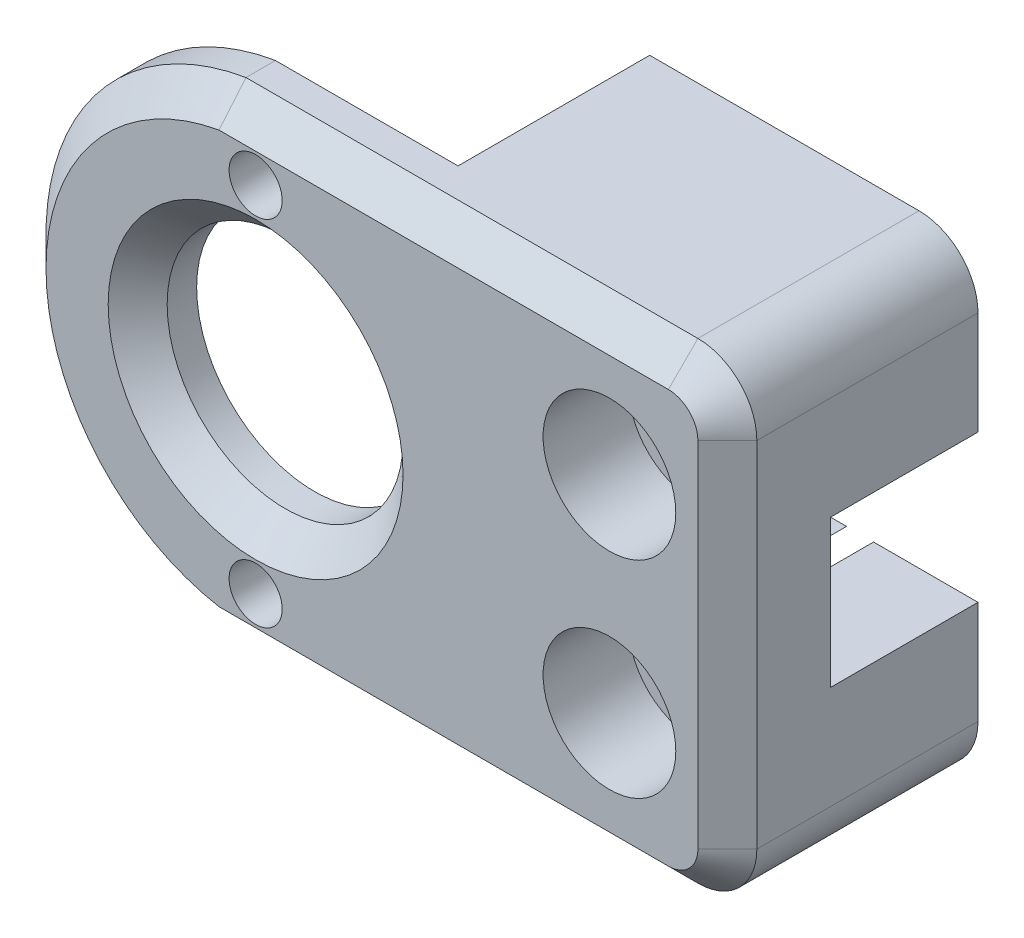
ISO-10303-21;
HEADER;
FILE_DESCRIPTION(('STEP AP214'),'2;1');
FILE_NAME('part.step','',(''),(''),'','','');
FILE_SCHEMA(('AUTOMOTIVE_DESIGN { 1 0 10303 214 1 1 1 1 }'));
ENDSEC;
DATA;
#1=APPLICATION_CONTEXT('core data for automotive mechanical design processes');
#2=APPLICATION_PROTOCOL_DEFINITION('international standard','automotive_design',2000,#1);
#3=PRODUCT_CONTEXT('',#1,'mechanical');
#4=PRODUCT('Part','Part','',(#3));
#5=PRODUCT_RELATED_PRODUCT_CATEGORY('part','',(#4));
#6=PRODUCT_DEFINITION_FORMATION('','',#4);
#7=PRODUCT_DEFINITION_CONTEXT('part definition',#1,'design');
#8=PRODUCT_DEFINITION('design','',#6,#7);
#9=PRODUCT_DEFINITION_SHAPE('','',#8);
#10=(LENGTH_UNIT() NAMED_UNIT(*) SI_UNIT(.MILLI.,.METRE.));
#11=(NAMED_UNIT(*) PLANE_ANGLE_UNIT() SI_UNIT($,.RADIAN.));
#12=(NAMED_UNIT(*) SI_UNIT($,.STERADIAN.) SOLID_ANGLE_UNIT());
#13=UNCERTAINTY_MEASURE_WITH_UNIT(LENGTH_MEASURE(1.E-05),#10,'distance_accuracy_value','');
#14=(GEOMETRIC_REPRESENTATION_CONTEXT(3) GLOBAL_UNCERTAINTY_ASSIGNED_CONTEXT((#13)) GLOBAL_UNIT_ASSIGNED_CONTEXT((#10,
#11,#12)) REPRESENTATION_CONTEXT('',''));
#15=CARTESIAN_POINT('',(0.,0.,0.));
#16=DIRECTION('',(0.,0.,1.));
#17=DIRECTION('',(1.,0.,0.));
#18=AXIS2_PLACEMENT_3D('',#15,#16,#17);
#19=CARTESIAN_POINT('',(12.,3.5,8.5));
#20=DIRECTION('',(0.,0.,-1.));
#21=DIRECTION('',(-1.,0.,0.));
#22=AXIS2_PLACEMENT_3D('',#19,#20,#21);
#23=CYLINDRICAL_SURFACE('',#22,1.1);
#24=DIRECTION('',(0.,0.,-1.));
#25=VECTOR('',#24,1.);
#26=CARTESIAN_POINT('',(12.4582575694956,2.5,8.5));
#27=LINE('',#26,#25);
#28=CARTESIAN_POINT('',(12.4582575694956,2.5,5.));
#29=VERTEX_POINT('',#28);
#30=CARTESIAN_POINT('',(12.4582575694956,2.5,0.));
#31=VERTEX_POINT('',#30);
#32=EDGE_CURVE('E497',#29,#31,#27,.T.);
#33=ORIENTED_EDGE('',*,*,#32,.F.);
#34=CARTESIAN_POINT('',(12.,3.5,5.));
#35=DIRECTION('',(0.,0.,1.));
#36=DIRECTION('',(1.,0.,0.));
#37=AXIS2_PLACEMENT_3D('',#34,#35,#36);
#38=CIRCLE('',#37,1.1);
#39=CARTESIAN_POINT('',(11.5417424305044,2.5,5.));
#40=VERTEX_POINT('',#39);
#41=EDGE_CURVE('E510',#40,#29,#38,.T.);
#42=ORIENTED_EDGE('',*,*,#41,.F.);
#43=DIRECTION('',(0.,0.,-1.));
#44=VECTOR('',#43,1.);
#45=CARTESIAN_POINT('',(11.5417424305044,2.5,8.5));
#46=LINE('',#45,#44);
#47=CARTESIAN_POINT('',(11.5417424305044,2.5,0.));
#48=VERTEX_POINT('',#47);
#49=EDGE_CURVE('E494',#48,#40,#46,.F.);
#50=ORIENTED_EDGE('',*,*,#49,.F.);
#51=CARTESIAN_POINT('',(12.,3.5,0.));
#52=DIRECTION('',(0.,0.,1.));
#53=DIRECTION('',(1.,0.,0.));
#54=AXIS2_PLACEMENT_3D('',#51,#52,#53);
#55=CIRCLE('',#54,1.1);
#56=EDGE_CURVE('E537',#31,#48,#55,.T.);
#57=ORIENTED_EDGE('',*,*,#56,.F.);
#58=EDGE_LOOP('',(#33,#42,#50,#57));
#59=FACE_BOUND('',#58,.T.);
#60=CARTESIAN_POINT('',(12.,3.5,5.6));
#61=DIRECTION('',(0.,0.,1.));
#62=DIRECTION('',(1.,0.,0.));
#63=AXIS2_PLACEMENT_3D('',#60,#61,#62);
#64=CIRCLE('',#63,1.1);
#65=CARTESIAN_POINT('',(13.1,3.5,5.6));
#66=VERTEX_POINT('',#65);
#67=EDGE_CURVE('E428',#66,#66,#64,.T.);
#68=ORIENTED_EDGE('',*,*,#67,.T.);
#69=EDGE_LOOP('',(#68));
#70=FACE_BOUND('',#69,.T.);
#71=ADVANCED_FACE('F37',(#59,#70),#23,.F.);
#72=CARTESIAN_POINT('',(0.,0.,8.5));
#73=DIRECTION('',(0.,0.,1.));
#74=DIRECTION('',(1.,0.,0.));
#75=AXIS2_PLACEMENT_3D('',#72,#73,#74);
#76=PLANE('',#75);
#77=CARTESIAN_POINT('',(0.,0.,8.5));
#78=DIRECTION('',(0.,0.,1.));
#79=DIRECTION('',(1.,0.,0.));
#80=AXIS2_PLACEMENT_3D('',#77,#78,#79);
#81=CIRCLE('',#80,5.);
#82=CARTESIAN_POINT('',(5.,0.,8.5));
#83=VERTEX_POINT('',#82);
#84=EDGE_CURVE('E13',#83,#83,#81,.F.);
#85=ORIENTED_EDGE('',*,*,#84,.T.);
#86=EDGE_LOOP('',(#85));
#87=FACE_BOUND('',#86,.T.);
#88=CARTESIAN_POINT('',(12.,3.5,8.5));
#89=DIRECTION('',(0.,0.,1.));
#90=DIRECTION('',(1.,0.,0.));
#91=AXIS2_PLACEMENT_3D('',#88,#89,#90);
#92=CIRCLE('',#91,2.25);
#93=CARTESIAN_POINT('',(14.25,3.5,8.5));
#94=VERTEX_POINT('',#93);
#95=EDGE_CURVE('E666',#94,#94,#92,.T.);
#96=ORIENTED_EDGE('',*,*,#95,.F.);
#97=EDGE_LOOP('',(#96));
#98=FACE_BOUND('',#97,.T.);
#99=CARTESIAN_POINT('',(0.,0.,8.5));
#100=DIRECTION('',(0.,0.,1.));
#101=DIRECTION('',(1.,0.,0.));
#102=AXIS2_PLACEMENT_3D('',#99,#100,#101);
#103=CIRCLE('',#102,7.10925397308531);
#104=CARTESIAN_POINT('',(-1.24156838468013,6.99999999999999,8.5));
#105=VERTEX_POINT('',#104);
#106=CARTESIAN_POINT('',(-1.24156838468013,-6.99999999999999,8.5));
#107=VERTEX_POINT('',#106);
#108=EDGE_CURVE('E568',#105,#107,#103,.T.);
#109=ORIENTED_EDGE('',*,*,#108,.T.);
#110=DIRECTION('',(-1.,0.,0.));
#111=VECTOR('',#110,1.);
#112=CARTESIAN_POINT('',(-1.32664991614216,-6.99999999999999,8.5));
#113=LINE('',#112,#111);
#114=CARTESIAN_POINT('',(14.,-6.99999999999999,8.5));
#115=VERTEX_POINT('',#114);
#116=EDGE_CURVE('E263',#115,#107,#113,.T.);
#117=ORIENTED_EDGE('',*,*,#116,.F.);
#118=CARTESIAN_POINT('',(14.,-5.99999999999999,8.5));
#119=DIRECTION('',(0.,0.,-1.));
#120=DIRECTION('',(1.,0.,0.));
#121=AXIS2_PLACEMENT_3D('',#118,#119,#120);
#122=CIRCLE('',#121,0.999999999999996);
#123=CARTESIAN_POINT('',(15.,-5.99999999999999,8.5));
#124=VERTEX_POINT('',#123);
#125=EDGE_CURVE('E266',#124,#115,#122,.T.);
#126=ORIENTED_EDGE('',*,*,#125,.F.);
#127=DIRECTION('',(0.,1.,0.));
#128=VECTOR('',#127,1.);
#129=CARTESIAN_POINT('',(15.,6.,8.5));
#130=LINE('',#129,#128);
#131=CARTESIAN_POINT('',(15.,6.,8.5));
#132=VERTEX_POINT('',#131);
#133=EDGE_CURVE('E572',#124,#132,#130,.T.);
#134=ORIENTED_EDGE('',*,*,#133,.T.);
#135=CARTESIAN_POINT('',(14.,6.,8.5));
#136=DIRECTION('',(0.,0.,1.));
#137=DIRECTION('',(1.,0.,0.));
#138=AXIS2_PLACEMENT_3D('',#135,#136,#137);
#139=CIRCLE('',#138,0.999999999999996);
#140=CARTESIAN_POINT('',(14.,7.,8.5));
#141=VERTEX_POINT('',#140);
#142=EDGE_CURVE('E570',#132,#141,#139,.T.);
#143=ORIENTED_EDGE('',*,*,#142,.T.);
#144=DIRECTION('',(-1.,0.,0.));
#145=VECTOR('',#144,1.);
#146=CARTESIAN_POINT('',(-1.32664991614216,6.99999999999999,8.5));
#147=LINE('',#146,#145);
#148=EDGE_CURVE('E566',#141,#105,#147,.T.);
#149=ORIENTED_EDGE('',*,*,#148,.T.);
#150=EDGE_LOOP('',(#109,#117,#126,#134,#143,#149));
#151=FACE_BOUND('',#150,.T.);
#152=CARTESIAN_POINT('',(0.,6.,8.5));
#153=DIRECTION('',(0.,0.,1.));
#154=DIRECTION('',(1.,0.,0.));
#155=AXIS2_PLACEMENT_3D('',#152,#153,#154);
#156=CIRCLE('',#155,0.9);
#157=CARTESIAN_POINT('',(0.9,6.,8.5));
#158=VERTEX_POINT('',#157);
#159=EDGE_CURVE('E540',#158,#158,#156,.T.);
#160=ORIENTED_EDGE('',*,*,#159,.F.);
#161=EDGE_LOOP('',(#160));
#162=FACE_BOUND('',#161,.T.);
#163=CARTESIAN_POINT('',(12.,-3.5,8.5));
#164=DIRECTION('',(0.,0.,-1.));
#165=DIRECTION('',(1.,0.,0.));
#166=AXIS2_PLACEMENT_3D('',#163,#164,#165);
#167=CIRCLE('',#166,2.25);
#168=CARTESIAN_POINT('',(14.25,-3.49999999999999,8.5));
#169=VERTEX_POINT('',#168);
#170=EDGE_CURVE('E442',#169,#169,#167,.T.);
#171=ORIENTED_EDGE('',*,*,#170,.T.);
#172=EDGE_LOOP('',(#171));
#173=FACE_BOUND('',#172,.T.);
#174=CARTESIAN_POINT('',(0.,-6.,8.5));
#175=DIRECTION('',(0.,0.,-1.));
#176=DIRECTION('',(1.,0.,0.));
#177=AXIS2_PLACEMENT_3D('',#174,#175,#176);
#178=CIRCLE('',#177,0.9);
#179=CARTESIAN_POINT('',(0.900000000000002,-6.,8.5));
#180=VERTEX_POINT('',#179);
#181=EDGE_CURVE('E236',#180,#180,#178,.T.);
#182=ORIENTED_EDGE('',*,*,#181,.T.);
#183=EDGE_LOOP('',(#182));
#184=FACE_BOUND('',#183,.T.);
#185=ADVANCED_FACE('F359',(#87,#98,#151,#162,#173,#184),#76,.T.);
#186=CARTESIAN_POINT('',(0.,0.,0.));
#187=DIRECTION('',(0.,0.,1.));
#188=DIRECTION('',(1.,0.,0.));
#189=AXIS2_PLACEMENT_3D('',#186,#187,#188);
#190=PLANE('',#189);
#191=DIRECTION('',(0.,1.,0.));
#192=VECTOR('',#191,1.);
#193=CARTESIAN_POINT('',(16.,8.,0.));
#194=LINE('',#193,#192);
#195=CARTESIAN_POINT('',(16.,2.5,0.));
#196=VERTEX_POINT('',#195);
#197=CARTESIAN_POINT('',(16.,6.,0.));
#198=VERTEX_POINT('',#197);
#199=EDGE_CURVE('E543',#196,#198,#194,.T.);
#200=ORIENTED_EDGE('',*,*,#199,.F.);
#201=DIRECTION('',(1.,0.,0.));
#202=VECTOR('',#201,1.);
#203=CARTESIAN_POINT('',(16.,2.5,0.));
#204=LINE('',#203,#202);
#205=EDGE_CURVE('E431',#31,#196,#204,.T.);
#206=ORIENTED_EDGE('',*,*,#205,.F.);
#207=ORIENTED_EDGE('',*,*,#56,.T.);
#208=CARTESIAN_POINT('',(8.,2.5,0.));
#209=VERTEX_POINT('',#208);
#210=EDGE_CURVE('E503',#209,#48,#204,.T.);
#211=ORIENTED_EDGE('',*,*,#210,.F.);
#212=DIRECTION('',(0.,-1.,0.));
#213=VECTOR('',#212,1.);
#214=CARTESIAN_POINT('',(8.,4.12310562561766,0.));
#215=LINE('',#214,#213);
#216=CARTESIAN_POINT('',(8.,4.12310562561766,0.));
#217=VERTEX_POINT('',#216);
#218=EDGE_CURVE('E513',#217,#209,#215,.T.);
#219=ORIENTED_EDGE('',*,*,#218,.F.);
#220=DIRECTION('',(0.631512516045507,-0.775365682809004,0.));
#221=VECTOR('',#220,1.);
#222=CARTESIAN_POINT('',(5.65685424949238,7.,0.));
#223=LINE('',#222,#221);
#224=CARTESIAN_POINT('',(5.65685424949238,7.,0.));
#225=VERTEX_POINT('',#224);
#226=EDGE_CURVE('E517',#225,#217,#223,.T.);
#227=ORIENTED_EDGE('',*,*,#226,.F.);
#228=CARTESIAN_POINT('',(0.,0.,0.));
#229=DIRECTION('',(0.,0.,-1.));
#230=DIRECTION('',(1.,0.,0.));
#231=AXIS2_PLACEMENT_3D('',#228,#229,#230);
#232=CIRCLE('',#231,9.);
#233=CARTESIAN_POINT('',(5.03913107919878,7.45702071652298,0.));
#234=VERTEX_POINT('',#233);
#235=EDGE_CURVE('E425',#234,#225,#232,.T.);
#236=ORIENTED_EDGE('',*,*,#235,.F.);
#237=DIRECTION('',(-0.304597589118864,0.952481132990557,0.));
#238=VECTOR('',#237,1.);
#239=CARTESIAN_POINT('',(4.8654896547547,8.,0.));
#240=LINE('',#239,#238);
#241=CARTESIAN_POINT('',(4.8654896547547,8.,0.));
#242=VERTEX_POINT('',#241);
#243=EDGE_CURVE('E564',#234,#242,#240,.T.);
#244=ORIENTED_EDGE('',*,*,#243,.T.);
#245=DIRECTION('',(-1.,0.,0.));
#246=VECTOR('',#245,1.);
#247=CARTESIAN_POINT('',(-1.32664991614216,8.,0.));
#248=LINE('',#247,#246);
#249=CARTESIAN_POINT('',(14.,8.,0.));
#250=VERTEX_POINT('',#249);
#251=EDGE_CURVE('E545',#250,#242,#248,.T.);
#252=ORIENTED_EDGE('',*,*,#251,.F.);
#253=CARTESIAN_POINT('',(14.,6.,0.));
#254=DIRECTION('',(0.,0.,1.));
#255=DIRECTION('',(1.,0.,0.));
#256=AXIS2_PLACEMENT_3D('',#253,#254,#255);
#257=CIRCLE('',#256,2.);
#258=EDGE_CURVE('E552',#250,#198,#257,.F.);
#259=ORIENTED_EDGE('',*,*,#258,.T.);
#260=EDGE_LOOP('',(#200,#206,#207,#211,#219,#227,#236,#244,#252,#259));
#261=FACE_BOUND('',#260,.T.);
#262=ADVANCED_FACE('F365',(#261),#190,.F.);
#263=CARTESIAN_POINT('',(0.,0.,8.5));
#264=DIRECTION('',(0.,0.,-1.));
#265=DIRECTION('',(-1.,0.,0.));
#266=AXIS2_PLACEMENT_3D('',#263,#264,#265);
#267=CYLINDRICAL_SURFACE('',#266,8.10925397308531);
#268=CARTESIAN_POINT('',(0.,0.,6.5));
#269=DIRECTION('',(0.,0.,1.));
#270=DIRECTION('',(1.,0.,0.));
#271=AXIS2_PLACEMENT_3D('',#268,#269,#270);
#272=CIRCLE('',#271,8.10925397308531);
#273=CARTESIAN_POINT('',(-1.32664991614216,8.,6.5));
#274=VERTEX_POINT('',#273);
#275=CARTESIAN_POINT('',(-1.32664991614216,-8.,6.5));
#276=VERTEX_POINT('',#275);
#277=EDGE_CURVE('E535',#274,#276,#272,.T.);
#278=ORIENTED_EDGE('',*,*,#277,.T.);
#279=DIRECTION('',(0.,0.,-1.));
#280=VECTOR('',#279,1.);
#281=CARTESIAN_POINT('',(-1.32664991614216,-8.,8.5));
#282=LINE('',#281,#280);
#283=CARTESIAN_POINT('',(-1.32664991614216,-8.,7.49999999999999));
#284=VERTEX_POINT('',#283);
#285=EDGE_CURVE('E239',#284,#276,#282,.T.);
#286=ORIENTED_EDGE('',*,*,#285,.F.);
#287=CARTESIAN_POINT('',(0.,0.,7.49999999999999));
#288=DIRECTION('',(0.,0.,1.));
#289=DIRECTION('',(1.,0.,0.));
#290=AXIS2_PLACEMENT_3D('',#287,#288,#289);
#291=CIRCLE('',#290,8.10925397308531);
#292=CARTESIAN_POINT('',(-1.32664991614216,8.,7.49999999999999));
#293=VERTEX_POINT('',#292);
#294=EDGE_CURVE('E578',#284,#293,#291,.F.);
#295=ORIENTED_EDGE('',*,*,#294,.T.);
#296=DIRECTION('',(0.,0.,-1.));
#297=VECTOR('',#296,1.);
#298=CARTESIAN_POINT('',(-1.32664991614216,8.,8.5));
#299=LINE('',#298,#297);
#300=EDGE_CURVE('E548',#293,#274,#299,.T.);
#301=ORIENTED_EDGE('',*,*,#300,.T.);
#302=EDGE_LOOP('',(#278,#286,#295,#301));
#303=FACE_BOUND('',#302,.T.);
#304=ADVANCED_FACE('F382',(#303),#267,.T.);
#305=CARTESIAN_POINT('',(16.,8.,8.5));
#306=DIRECTION('',(-1.,0.,0.));
#307=DIRECTION('',(0.,0.,1.));
#308=AXIS2_PLACEMENT_3D('',#305,#306,#307);
#309=PLANE('',#308);
#310=DIRECTION('',(0.,-1.,0.));
#311=VECTOR('',#310,1.);
#312=CARTESIAN_POINT('',(16.,0.,7.49999999999999));
#313=LINE('',#312,#311);
#314=CARTESIAN_POINT('',(16.,6.,7.49999999999999));
#315=VERTEX_POINT('',#314);
#316=CARTESIAN_POINT('',(16.,-5.99999999999999,7.49999999999999));
#317=VERTEX_POINT('',#316);
#318=EDGE_CURVE('E575',#315,#317,#313,.T.);
#319=ORIENTED_EDGE('',*,*,#318,.T.);
#320=DIRECTION('',(0.,0.,-1.));
#321=VECTOR('',#320,1.);
#322=CARTESIAN_POINT('',(16.,-5.99999999999999,8.5));
#323=LINE('',#322,#321);
#324=CARTESIAN_POINT('',(16.,-5.99999999999999,0.));
#325=VERTEX_POINT('',#324);
#326=EDGE_CURVE('E233',#325,#317,#323,.F.);
#327=ORIENTED_EDGE('',*,*,#326,.F.);
#328=DIRECTION('',(0.,-1.,0.));
#329=VECTOR('',#328,1.);
#330=CARTESIAN_POINT('',(16.,-7.99999999999999,0.));
#331=LINE('',#330,#329);
#332=CARTESIAN_POINT('',(16.,-2.49999999999999,0.));
#333=VERTEX_POINT('',#332);
#334=EDGE_CURVE('E224',#333,#325,#331,.T.);
#335=ORIENTED_EDGE('',*,*,#334,.F.);
#336=DIRECTION('',(0.,0.,-1.));
#337=VECTOR('',#336,1.);
#338=CARTESIAN_POINT('',(16.,-2.49999999999999,14.8815273071201));
#339=LINE('',#338,#337);
#340=CARTESIAN_POINT('',(16.,-2.49999999999999,5.));
#341=VERTEX_POINT('',#340);
#342=EDGE_CURVE('E207',#341,#333,#339,.T.);
#343=ORIENTED_EDGE('',*,*,#342,.F.);
#344=DIRECTION('',(0.,-1.,0.));
#345=VECTOR('',#344,1.);
#346=CARTESIAN_POINT('',(16.,0.,5.));
#347=LINE('',#346,#345);
#348=CARTESIAN_POINT('',(16.,2.5,5.));
#349=VERTEX_POINT('',#348);
#350=EDGE_CURVE('E489',#349,#341,#347,.T.);
#351=ORIENTED_EDGE('',*,*,#350,.F.);
#352=DIRECTION('',(0.,0.,-1.));
#353=VECTOR('',#352,1.);
#354=CARTESIAN_POINT('',(16.,2.5,14.8815273071201));
#355=LINE('',#354,#353);
#356=EDGE_CURVE('E495',#349,#196,#355,.T.);
#357=ORIENTED_EDGE('',*,*,#356,.T.);
#358=ORIENTED_EDGE('',*,*,#199,.T.);
#359=DIRECTION('',(0.,0.,-1.));
#360=VECTOR('',#359,1.);
#361=CARTESIAN_POINT('',(16.,6.,8.5));
#362=LINE('',#361,#360);
#363=EDGE_CURVE('E555',#198,#315,#362,.F.);
#364=ORIENTED_EDGE('',*,*,#363,.T.);
#365=EDGE_LOOP('',(#319,#327,#335,#343,#351,#357,#358,#364));
#366=FACE_BOUND('',#365,.T.);
#367=ADVANCED_FACE('F231',(#366),#309,.F.);
#368=CARTESIAN_POINT('',(-1.32664991614216,8.,8.5));
#369=DIRECTION('',(0.,-1.,0.));
#370=DIRECTION('',(1.,0.,0.));
#371=AXIS2_PLACEMENT_3D('',#368,#369,#370);
#372=PLANE('',#371);
#373=ORIENTED_EDGE('',*,*,#251,.T.);
#374=DIRECTION('',(0.,0.,1.));
#375=VECTOR('',#374,1.);
#376=CARTESIAN_POINT('',(4.8654896547547,8.,8.5));
#377=LINE('',#376,#375);
#378=CARTESIAN_POINT('',(4.8654896547547,8.,6.5));
#379=VERTEX_POINT('',#378);
#380=EDGE_CURVE('E559',#242,#379,#377,.T.);
#381=ORIENTED_EDGE('',*,*,#380,.T.);
#382=DIRECTION('',(-1.,0.,0.));
#383=VECTOR('',#382,1.);
#384=CARTESIAN_POINT('',(-1.32664991614216,8.,6.5));
#385=LINE('',#384,#383);
#386=EDGE_CURVE('E532',#379,#274,#385,.T.);
#387=ORIENTED_EDGE('',*,*,#386,.T.);
#388=ORIENTED_EDGE('',*,*,#300,.F.);
#389=DIRECTION('',(1.,0.,0.));
#390=VECTOR('',#389,1.);
#391=CARTESIAN_POINT('',(14.,8.,7.49999999999999));
#392=LINE('',#391,#390);
#393=CARTESIAN_POINT('',(14.,8.,7.49999999999999));
#394=VERTEX_POINT('',#393);
#395=EDGE_CURVE('E557',#293,#394,#392,.T.);
#396=ORIENTED_EDGE('',*,*,#395,.T.);
#397=DIRECTION('',(0.,0.,-1.));
#398=VECTOR('',#397,1.);
#399=CARTESIAN_POINT('',(14.,8.,8.5));
#400=LINE('',#399,#398);
#401=EDGE_CURVE('E550',#394,#250,#400,.T.);
#402=ORIENTED_EDGE('',*,*,#401,.T.);
#403=EDGE_LOOP('',(#373,#381,#387,#388,#396,#402));
#404=FACE_BOUND('',#403,.T.);
#405=ADVANCED_FACE('F377',(#404),#372,.F.);
#406=CARTESIAN_POINT('',(0.,6.,8.5));
#407=DIRECTION('',(0.,0.,-1.));
#408=DIRECTION('',(-1.,0.,0.));
#409=AXIS2_PLACEMENT_3D('',#406,#407,#408);
#410=CYLINDRICAL_SURFACE('',#409,0.9);
#411=CARTESIAN_POINT('',(0.,6.,6.7));
#412=DIRECTION('',(0.,0.,1.));
#413=DIRECTION('',(1.,0.,0.));
#414=AXIS2_PLACEMENT_3D('',#411,#412,#413);
#415=CIRCLE('',#414,0.9);
#416=CARTESIAN_POINT('',(0.9,6.,6.7));
#417=VERTEX_POINT('',#416);
#418=EDGE_CURVE('E436',#417,#417,#415,.F.);
#419=ORIENTED_EDGE('',*,*,#418,.T.);
#420=EDGE_LOOP('',(#419));
#421=FACE_BOUND('',#420,.T.);
#422=ORIENTED_EDGE('',*,*,#159,.T.);
#423=EDGE_LOOP('',(#422));
#424=FACE_BOUND('',#423,.T.);
#425=ADVANCED_FACE('F374',(#421,#424),#410,.F.);
#426=CARTESIAN_POINT('',(14.,6.,8.5));
#427=DIRECTION('',(0.,0.,-1.));
#428=DIRECTION('',(-1.,0.,0.));
#429=AXIS2_PLACEMENT_3D('',#426,#427,#428);
#430=CYLINDRICAL_SURFACE('',#429,2.);
#431=ORIENTED_EDGE('',*,*,#401,.F.);
#432=CARTESIAN_POINT('',(14.,6.,7.49999999999999));
#433=DIRECTION('',(0.,0.,1.));
#434=DIRECTION('',(1.,0.,0.));
#435=AXIS2_PLACEMENT_3D('',#432,#433,#434);
#436=CIRCLE('',#435,2.);
#437=EDGE_CURVE('E60',#394,#315,#436,.F.);
#438=ORIENTED_EDGE('',*,*,#437,.T.);
#439=ORIENTED_EDGE('',*,*,#363,.F.);
#440=ORIENTED_EDGE('',*,*,#258,.F.);
#441=EDGE_LOOP('',(#431,#438,#439,#440));
#442=FACE_BOUND('',#441,.T.);
#443=ADVANCED_FACE('F376',(#442),#430,.T.);
#444=CARTESIAN_POINT('',(0.,0.,27.7353840616713));
#445=DIRECTION('',(0.,0.,-1.));
#446=DIRECTION('',(-1.,0.,0.));
#447=AXIS2_PLACEMENT_3D('',#444,#445,#446);
#448=CYLINDRICAL_SURFACE('',#447,9.);
#449=CARTESIAN_POINT('',(0.,0.,6.5));
#450=DIRECTION('',(0.,0.,1.));
#451=DIRECTION('',(1.,0.,0.));
#452=AXIS2_PLACEMENT_3D('',#449,#450,#451);
#453=CIRCLE('',#452,9.);
#454=CARTESIAN_POINT('',(5.03913107919878,7.45702071652298,6.5));
#455=VERTEX_POINT('',#454);
#456=CARTESIAN_POINT('',(5.65685424949238,7.,6.5));
#457=VERTEX_POINT('',#456);
#458=EDGE_CURVE('E524',#455,#457,#453,.F.);
#459=ORIENTED_EDGE('',*,*,#458,.F.);
#460=DIRECTION('',(0.,0.,-1.));
#461=VECTOR('',#460,1.);
#462=CARTESIAN_POINT('',(5.03913107919878,7.45702071652298,27.7353840616713));
#463=LINE('',#462,#461);
#464=EDGE_CURVE('E562',#455,#234,#463,.T.);
#465=ORIENTED_EDGE('',*,*,#464,.T.);
#466=ORIENTED_EDGE('',*,*,#235,.T.);
#467=DIRECTION('',(0.,0.,-1.));
#468=VECTOR('',#467,1.);
#469=CARTESIAN_POINT('',(5.65685424949238,7.,27.7353840616713));
#470=LINE('',#469,#468);
#471=EDGE_CURVE('E526',#457,#225,#470,.T.);
#472=ORIENTED_EDGE('',*,*,#471,.F.);
#473=EDGE_LOOP('',(#459,#465,#466,#472));
#474=FACE_BOUND('',#473,.T.);
#475=ADVANCED_FACE('F394',(#474),#448,.F.);
#476=CARTESIAN_POINT('',(0.,0.,6.5));
#477=DIRECTION('',(0.,0.,1.));
#478=DIRECTION('',(1.,0.,0.));
#479=AXIS2_PLACEMENT_3D('',#476,#477,#478);
#480=PLANE('',#479);
#481=CARTESIAN_POINT('',(0.,0.,6.5));
#482=DIRECTION('',(0.,0.,1.));
#483=DIRECTION('',(1.,0.,0.));
#484=AXIS2_PLACEMENT_3D('',#481,#482,#483);
#485=CIRCLE('',#484,4.);
#486=CARTESIAN_POINT('',(4.,0.,6.5));
#487=VERTEX_POINT('',#486);
#488=EDGE_CURVE('E440',#487,#487,#485,.T.);
#489=ORIENTED_EDGE('',*,*,#488,.T.);
#490=EDGE_LOOP('',(#489));
#491=FACE_BOUND('',#490,.T.);
#492=CARTESIAN_POINT('',(0.,6.,6.5));
#493=DIRECTION('',(0.,0.,1.));
#494=DIRECTION('',(1.,0.,0.));
#495=AXIS2_PLACEMENT_3D('',#492,#493,#494);
#496=CIRCLE('',#495,1.1);
#497=CARTESIAN_POINT('',(1.1,6.,6.5));
#498=VERTEX_POINT('',#497);
#499=EDGE_CURVE('E433',#498,#498,#496,.T.);
#500=ORIENTED_EDGE('',*,*,#499,.T.);
#501=EDGE_LOOP('',(#500));
#502=FACE_BOUND('',#501,.T.);
#503=ORIENTED_EDGE('',*,*,#386,.F.);
#504=DIRECTION('',(0.304597589118864,-0.952481132990557,0.));
#505=VECTOR('',#504,1.);
#506=CARTESIAN_POINT('',(6.73505868089872,2.15383020799024,6.5));
#507=LINE('',#506,#505);
#508=EDGE_CURVE('E437',#379,#455,#507,.T.);
#509=ORIENTED_EDGE('',*,*,#508,.T.);
#510=ORIENTED_EDGE('',*,*,#458,.T.);
#511=DIRECTION('',(0.631512516045507,-0.775365682809004,0.));
#512=VECTOR('',#511,1.);
#513=CARTESIAN_POINT('',(5.65685424949238,7.,6.5));
#514=LINE('',#513,#512);
#515=CARTESIAN_POINT('',(8.,4.12310562561766,6.5));
#516=VERTEX_POINT('',#515);
#517=EDGE_CURVE('E516',#457,#516,#514,.T.);
#518=ORIENTED_EDGE('',*,*,#517,.T.);
#519=DIRECTION('',(0.,-1.,0.));
#520=VECTOR('',#519,1.);
#521=CARTESIAN_POINT('',(8.,4.12310562561766,6.5));
#522=LINE('',#521,#520);
#523=CARTESIAN_POINT('',(8.,-4.12310562561766,6.5));
#524=VERTEX_POINT('',#523);
#525=EDGE_CURVE('E527',#516,#524,#522,.T.);
#526=ORIENTED_EDGE('',*,*,#525,.T.);
#527=DIRECTION('',(0.631512516045507,0.775365682809004,0.));
#528=VECTOR('',#527,1.);
#529=CARTESIAN_POINT('',(5.65685424949238,-7.,6.5));
#530=LINE('',#529,#528);
#531=CARTESIAN_POINT('',(5.65685424949238,-7.,6.5));
#532=VERTEX_POINT('',#531);
#533=EDGE_CURVE('E467',#532,#524,#530,.T.);
#534=ORIENTED_EDGE('',*,*,#533,.F.);
#535=CARTESIAN_POINT('',(0.,0.,6.5));
#536=DIRECTION('',(0.,0.,-1.));
#537=DIRECTION('',(1.,0.,0.));
#538=AXIS2_PLACEMENT_3D('',#535,#536,#537);
#539=CIRCLE('',#538,9.);
#540=CARTESIAN_POINT('',(5.03913107919878,-7.45702071652298,6.5));
#541=VERTEX_POINT('',#540);
#542=EDGE_CURVE('E476',#541,#532,#539,.F.);
#543=ORIENTED_EDGE('',*,*,#542,.F.);
#544=DIRECTION('',(0.304597589118864,0.952481132990557,0.));
#545=VECTOR('',#544,1.);
#546=CARTESIAN_POINT('',(6.73505868089872,-2.15383020799024,6.5));
#547=LINE('',#546,#545);
#548=CARTESIAN_POINT('',(4.86548965475471,-8.,6.5));
#549=VERTEX_POINT('',#548);
#550=EDGE_CURVE('E272',#549,#541,#547,.T.);
#551=ORIENTED_EDGE('',*,*,#550,.F.);
#552=DIRECTION('',(-1.,0.,0.));
#553=VECTOR('',#552,1.);
#554=CARTESIAN_POINT('',(-1.32664991614216,-8.,6.5));
#555=LINE('',#554,#553);
#556=EDGE_CURVE('E482',#549,#276,#555,.T.);
#557=ORIENTED_EDGE('',*,*,#556,.T.);
#558=ORIENTED_EDGE('',*,*,#277,.F.);
#559=EDGE_LOOP('',(#503,#509,#510,#518,#526,#534,#543,#551,#557,#558));
#560=FACE_BOUND('',#559,.T.);
#561=CARTESIAN_POINT('',(0.,-6.,6.5));
#562=DIRECTION('',(0.,0.,-1.));
#563=DIRECTION('',(1.,0.,0.));
#564=AXIS2_PLACEMENT_3D('',#561,#562,#563);
#565=CIRCLE('',#564,1.1);
#566=CARTESIAN_POINT('',(1.1,-6.,6.5));
#567=VERTEX_POINT('',#566);
#568=EDGE_CURVE('E274',#567,#567,#565,.T.);
#569=ORIENTED_EDGE('',*,*,#568,.F.);
#570=EDGE_LOOP('',(#569));
#571=FACE_BOUND('',#570,.T.);
#572=ADVANCED_FACE('F372',(#491,#502,#560,#571),#480,.F.);
#573=CARTESIAN_POINT('',(5.65685424949238,7.,27.7353840616713));
#574=DIRECTION('',(0.775365682809004,0.631512516045507,0.));
#575=DIRECTION('',(-0.631512516045507,0.775365682809004,0.));
#576=AXIS2_PLACEMENT_3D('',#573,#574,#575);
#577=PLANE('',#576);
#578=ORIENTED_EDGE('',*,*,#471,.T.);
#579=ORIENTED_EDGE('',*,*,#226,.T.);
#580=DIRECTION('',(0.,0.,-1.));
#581=VECTOR('',#580,1.);
#582=CARTESIAN_POINT('',(8.,4.12310562561766,27.7353840616713));
#583=LINE('',#582,#581);
#584=EDGE_CURVE('E523',#516,#217,#583,.T.);
#585=ORIENTED_EDGE('',*,*,#584,.F.);
#586=ORIENTED_EDGE('',*,*,#517,.F.);
#587=EDGE_LOOP('',(#578,#579,#585,#586));
#588=FACE_BOUND('',#587,.T.);
#589=ADVANCED_FACE('F615',(#588),#577,.F.);
#590=CARTESIAN_POINT('',(8.,4.12310562561766,27.7353840616713));
#591=DIRECTION('',(1.,0.,0.));
#592=DIRECTION('',(0.,0.,-1.));
#593=AXIS2_PLACEMENT_3D('',#590,#591,#592);
#594=PLANE('',#593);
#595=DIRECTION('',(0.,0.,-1.));
#596=VECTOR('',#595,1.);
#597=CARTESIAN_POINT('',(8.,2.5,14.8815273071201));
#598=LINE('',#597,#596);
#599=CARTESIAN_POINT('',(8.,2.5,5.));
#600=VERTEX_POINT('',#599);
#601=EDGE_CURVE('E506',#600,#209,#598,.T.);
#602=ORIENTED_EDGE('',*,*,#601,.F.);
#603=DIRECTION('',(0.,1.,0.));
#604=VECTOR('',#603,1.);
#605=CARTESIAN_POINT('',(8.,0.,5.));
#606=LINE('',#605,#604);
#607=CARTESIAN_POINT('',(8.,-2.5,5.));
#608=VERTEX_POINT('',#607);
#609=EDGE_CURVE('E52',#608,#600,#606,.T.);
#610=ORIENTED_EDGE('',*,*,#609,.F.);
#611=DIRECTION('',(0.,0.,-1.));
#612=VECTOR('',#611,1.);
#613=CARTESIAN_POINT('',(8.,-2.5,14.8815273071201));
#614=LINE('',#613,#612);
#615=CARTESIAN_POINT('',(8.,-2.5,0.));
#616=VERTEX_POINT('',#615);
#617=EDGE_CURVE('E455',#608,#616,#614,.T.);
#618=ORIENTED_EDGE('',*,*,#617,.T.);
#619=DIRECTION('',(0.,1.,0.));
#620=VECTOR('',#619,1.);
#621=CARTESIAN_POINT('',(8.,-4.12310562561766,0.));
#622=LINE('',#621,#620);
#623=CARTESIAN_POINT('',(8.,-4.12310562561766,0.));
#624=VERTEX_POINT('',#623);
#625=EDGE_CURVE('E464',#624,#616,#622,.T.);
#626=ORIENTED_EDGE('',*,*,#625,.F.);
#627=DIRECTION('',(0.,0.,-1.));
#628=VECTOR('',#627,1.);
#629=CARTESIAN_POINT('',(8.,-4.12310562561766,27.7353840616713));
#630=LINE('',#629,#628);
#631=EDGE_CURVE('E475',#524,#624,#630,.T.);
#632=ORIENTED_EDGE('',*,*,#631,.F.);
#633=ORIENTED_EDGE('',*,*,#525,.F.);
#634=ORIENTED_EDGE('',*,*,#584,.T.);
#635=ORIENTED_EDGE('',*,*,#218,.T.);
#636=EDGE_LOOP('',(#602,#610,#618,#626,#632,#633,#634,#635));
#637=FACE_BOUND('',#636,.T.);
#638=ADVANCED_FACE('F399',(#637),#594,.F.);
#639=CARTESIAN_POINT('',(4.8654896547547,8.,27.7353840616713));
#640=DIRECTION('',(-0.952481132990557,-0.304597589118864,0.));
#641=DIRECTION('',(0.,0.,-1.));
#642=AXIS2_PLACEMENT_3D('',#639,#640,#641);
#643=PLANE('',#642);
#644=ORIENTED_EDGE('',*,*,#243,.F.);
#645=ORIENTED_EDGE('',*,*,#464,.F.);
#646=ORIENTED_EDGE('',*,*,#508,.F.);
#647=ORIENTED_EDGE('',*,*,#380,.F.);
#648=EDGE_LOOP('',(#644,#645,#646,#647));
#649=FACE_BOUND('',#648,.T.);
#650=ADVANCED_FACE('F395',(#649),#643,.T.);
#651=CARTESIAN_POINT('',(0.,0.,8.5));
#652=DIRECTION('',(0.,0.,-1.));
#653=DIRECTION('',(-1.,0.,0.));
#654=AXIS2_PLACEMENT_3D('',#651,#652,#653);
#655=CONICAL_SURFACE('',#654,7.10925397308531,0.785398163397447);
#656=ORIENTED_EDGE('',*,*,#294,.F.);
#657=CARTESIAN_POINT('',(-1.32664991614216,-8.,7.49999999999999));
#658=CARTESIAN_POINT('',(-1.3129376124772,-7.83331343715008,7.66668656284991));
#659=CARTESIAN_POINT('',(-1.29899133349733,-7.66663682778922,7.83336317221077));
#660=CARTESIAN_POINT('',(-1.27063082307066,-7.33330349445321,8.16669650554679));
#661=CARTESIAN_POINT('',(-1.25621659156324,-7.16664677048064,8.33335322951935));
#662=CARTESIAN_POINT('',(-1.24156838468028,-6.99999999999971,8.50000000000029));
#663=B_SPLINE_CURVE_WITH_KNOTS('',3,(#657,#658,#659,#660,#661,#662),.UNSPECIFIED.,.F.,.F.,(4,2,
4),(0.,0.70838559148326,1.41677127474088),.UNSPECIFIED.);
#664=EDGE_CURVE('E281',#284,#107,#663,.T.);
#665=ORIENTED_EDGE('',*,*,#664,.T.);
#666=ORIENTED_EDGE('',*,*,#108,.F.);
#667=CARTESIAN_POINT('',(-1.32664991614216,8.,7.49999999999999));
#668=CARTESIAN_POINT('',(-1.3129376124772,7.83331343715008,7.66668656284991));
#669=CARTESIAN_POINT('',(-1.29899133349733,7.66663682778922,7.83336317221077));
#670=CARTESIAN_POINT('',(-1.27063082307066,7.33330349445321,8.16669650554679));
#671=CARTESIAN_POINT('',(-1.25621659156324,7.16664677048064,8.33335322951935));
#672=CARTESIAN_POINT('',(-1.24156838468029,6.99999999999971,8.50000000000029));
#673=B_SPLINE_CURVE_WITH_KNOTS('',3,(#667,#668,#669,#670,#671,#672),.UNSPECIFIED.,.F.,.F.,(4,2,
4),(0.,0.70838559148326,1.41677127474088),.UNSPECIFIED.);
#674=EDGE_CURVE('E417',#293,#105,#673,.T.);
#675=ORIENTED_EDGE('',*,*,#674,.F.);
#676=EDGE_LOOP('',(#656,#665,#666,#675));
#677=FACE_BOUND('',#676,.T.);
#678=ADVANCED_FACE('F398',(#677),#655,.T.);
#679=CARTESIAN_POINT('',(0.,6.99999999999999,8.5));
#680=DIRECTION('',(0.,0.707106781186549,0.707106781186546));
#681=DIRECTION('',(1.,0.,0.));
#682=AXIS2_PLACEMENT_3D('',#679,#680,#681);
#683=PLANE('',#682);
#684=ORIENTED_EDGE('',*,*,#674,.T.);
#685=ORIENTED_EDGE('',*,*,#148,.F.);
#686=DIRECTION('',(0.,-0.707106781186546,0.707106781186549));
#687=VECTOR('',#686,1.);
#688=CARTESIAN_POINT('',(14.,8.,7.49999999999999));
#689=LINE('',#688,#687);
#690=EDGE_CURVE('E426',#394,#141,#689,.T.);
#691=ORIENTED_EDGE('',*,*,#690,.F.);
#692=ORIENTED_EDGE('',*,*,#395,.F.);
#693=EDGE_LOOP('',(#684,#685,#691,#692));
#694=FACE_BOUND('',#693,.T.);
#695=ADVANCED_FACE('F409',(#694),#683,.T.);
#696=CARTESIAN_POINT('',(14.,6.,8.5));
#697=DIRECTION('',(0.,0.,-1.));
#698=DIRECTION('',(-1.,0.,0.));
#699=AXIS2_PLACEMENT_3D('',#696,#697,#698);
#700=CONICAL_SURFACE('',#699,0.999999999999996,0.785398163397447);
#701=ORIENTED_EDGE('',*,*,#690,.T.);
#702=ORIENTED_EDGE('',*,*,#142,.F.);
#703=DIRECTION('',(-0.707106781186546,0.,0.707106781186549));
#704=VECTOR('',#703,1.);
#705=CARTESIAN_POINT('',(16.,6.,7.49999999999999));
#706=LINE('',#705,#704);
#707=EDGE_CURVE('E512',#315,#132,#706,.T.);
#708=ORIENTED_EDGE('',*,*,#707,.F.);
#709=ORIENTED_EDGE('',*,*,#437,.F.);
#710=EDGE_LOOP('',(#701,#702,#708,#709));
#711=FACE_BOUND('',#710,.T.);
#712=ADVANCED_FACE('F405',(#711),#700,.T.);
#713=CARTESIAN_POINT('',(15.,0.,8.5));
#714=DIRECTION('',(0.707106781186549,0.,0.707106781186546));
#715=DIRECTION('',(0.,-1.,0.));
#716=AXIS2_PLACEMENT_3D('',#713,#714,#715);
#717=PLANE('',#716);
#718=ORIENTED_EDGE('',*,*,#133,.F.);
#719=DIRECTION('',(-0.707106781186546,0.,0.707106781186549));
#720=VECTOR('',#719,1.);
#721=CARTESIAN_POINT('',(16.,-5.99999999999999,7.49999999999999));
#722=LINE('',#721,#720);
#723=EDGE_CURVE('E275',#317,#124,#722,.T.);
#724=ORIENTED_EDGE('',*,*,#723,.F.);
#725=ORIENTED_EDGE('',*,*,#318,.F.);
#726=ORIENTED_EDGE('',*,*,#707,.T.);
#727=EDGE_LOOP('',(#718,#724,#725,#726));
#728=FACE_BOUND('',#727,.T.);
#729=ADVANCED_FACE('F401',(#728),#717,.T.);
#730=CARTESIAN_POINT('',(16.,2.5,14.8815273071201));
#731=DIRECTION('',(0.,1.,0.));
#732=DIRECTION('',(0.,0.,1.));
#733=AXIS2_PLACEMENT_3D('',#730,#731,#732);
#734=PLANE('',#733);
#735=ORIENTED_EDGE('',*,*,#32,.T.);
#736=ORIENTED_EDGE('',*,*,#205,.T.);
#737=ORIENTED_EDGE('',*,*,#356,.F.);
#738=DIRECTION('',(1.,0.,0.));
#739=VECTOR('',#738,1.);
#740=CARTESIAN_POINT('',(16.,2.5,5.));
#741=LINE('',#740,#739);
#742=EDGE_CURVE('E491',#29,#349,#741,.T.);
#743=ORIENTED_EDGE('',*,*,#742,.F.);
#744=EDGE_LOOP('',(#735,#736,#737,#743));
#745=FACE_BOUND('',#744,.T.);
#746=ADVANCED_FACE('F404',(#745),#734,.F.);
#747=CARTESIAN_POINT('',(0.,0.,5.));
#748=DIRECTION('',(0.,0.,1.));
#749=DIRECTION('',(1.,0.,0.));
#750=AXIS2_PLACEMENT_3D('',#747,#748,#749);
#751=PLANE('',#750);
#752=ORIENTED_EDGE('',*,*,#41,.T.);
#753=ORIENTED_EDGE('',*,*,#742,.T.);
#754=ORIENTED_EDGE('',*,*,#350,.T.);
#755=DIRECTION('',(1.,0.,0.));
#756=VECTOR('',#755,1.);
#757=CARTESIAN_POINT('',(16.,-2.49999999999999,5.));
#758=LINE('',#757,#756);
#759=CARTESIAN_POINT('',(12.4582575694956,-2.5,5.));
#760=VERTEX_POINT('',#759);
#761=EDGE_CURVE('E213',#760,#341,#758,.T.);
#762=ORIENTED_EDGE('',*,*,#761,.F.);
#763=CARTESIAN_POINT('',(12.,-3.5,5.));
#764=DIRECTION('',(0.,0.,-1.));
#765=DIRECTION('',(1.,0.,0.));
#766=AXIS2_PLACEMENT_3D('',#763,#764,#765);
#767=CIRCLE('',#766,1.1);
#768=CARTESIAN_POINT('',(11.5417424305044,-2.5,5.));
#769=VERTEX_POINT('',#768);
#770=EDGE_CURVE('E279',#769,#760,#767,.T.);
#771=ORIENTED_EDGE('',*,*,#770,.F.);
#772=EDGE_CURVE('E218',#608,#769,#758,.T.);
#773=ORIENTED_EDGE('',*,*,#772,.F.);
#774=ORIENTED_EDGE('',*,*,#609,.T.);
#775=EDGE_CURVE('E499',#600,#40,#741,.T.);
#776=ORIENTED_EDGE('',*,*,#775,.T.);
#777=EDGE_LOOP('',(#752,#753,#754,#762,#771,#773,#774,#776));
#778=FACE_BOUND('',#777,.T.);
#779=ADVANCED_FACE('F487',(#778),#751,.F.);
#780=ORIENTED_EDGE('',*,*,#49,.T.);
#781=ORIENTED_EDGE('',*,*,#775,.F.);
#782=ORIENTED_EDGE('',*,*,#601,.T.);
#783=ORIENTED_EDGE('',*,*,#210,.T.);
#784=EDGE_LOOP('',(#780,#781,#782,#783));
#785=FACE_BOUND('',#784,.T.);
#786=ADVANCED_FACE('F636',(#785),#734,.F.);
#787=CARTESIAN_POINT('',(12.,3.5,-1.36396103067893));
#788=DIRECTION('',(0.,0.,1.));
#789=DIRECTION('',(1.,0.,0.));
#790=AXIS2_PLACEMENT_3D('',#787,#788,#789);
#791=CYLINDRICAL_SURFACE('',#790,2.25);
#792=CARTESIAN_POINT('',(12.,3.5,5.6));
#793=DIRECTION('',(0.,0.,1.));
#794=DIRECTION('',(1.,0.,0.));
#795=AXIS2_PLACEMENT_3D('',#792,#793,#794);
#796=CIRCLE('',#795,2.25);
#797=CARTESIAN_POINT('',(14.25,3.5,5.6));
#798=VERTEX_POINT('',#797);
#799=EDGE_CURVE('E432',#798,#798,#796,.F.);
#800=ORIENTED_EDGE('',*,*,#799,.T.);
#801=EDGE_LOOP('',(#800));
#802=FACE_BOUND('',#801,.T.);
#803=ORIENTED_EDGE('',*,*,#95,.T.);
#804=EDGE_LOOP('',(#803));
#805=FACE_BOUND('',#804,.T.);
#806=ADVANCED_FACE('F650',(#802,#805),#791,.F.);
#807=CARTESIAN_POINT('',(0.,0.,5.6));
#808=DIRECTION('',(0.,0.,1.));
#809=DIRECTION('',(1.,0.,0.));
#810=AXIS2_PLACEMENT_3D('',#807,#808,#809);
#811=PLANE('',#810);
#812=ORIENTED_EDGE('',*,*,#67,.F.);
#813=EDGE_LOOP('',(#812));
#814=FACE_BOUND('',#813,.T.);
#815=ORIENTED_EDGE('',*,*,#799,.F.);
#816=EDGE_LOOP('',(#815));
#817=FACE_BOUND('',#816,.T.);
#818=ADVANCED_FACE('F654',(#814,#817),#811,.T.);
#819=CARTESIAN_POINT('',(0.,6.,6.5));
#820=DIRECTION('',(0.,0.,-1.));
#821=DIRECTION('',(-1.,0.,0.));
#822=AXIS2_PLACEMENT_3D('',#819,#820,#821);
#823=CONICAL_SURFACE('',#822,1.1,0.785398163397448);
#824=ORIENTED_EDGE('',*,*,#418,.F.);
#825=EDGE_LOOP('',(#824));
#826=FACE_BOUND('',#825,.T.);
#827=ORIENTED_EDGE('',*,*,#499,.F.);
#828=EDGE_LOOP('',(#827));
#829=FACE_BOUND('',#828,.T.);
#830=ADVANCED_FACE('F326',(#826,#829),#823,.F.);
#831=CARTESIAN_POINT('',(12.,-3.5,8.5));
#832=DIRECTION('',(0.,0.,-1.));
#833=DIRECTION('',(-1.,0.,0.));
#834=AXIS2_PLACEMENT_3D('',#831,#832,#833);
#835=CYLINDRICAL_SURFACE('',#834,1.1);
#836=DIRECTION('',(0.,0.,-1.));
#837=VECTOR('',#836,1.);
#838=CARTESIAN_POINT('',(12.4582575694956,-2.5,8.5));
#839=LINE('',#838,#837);
#840=CARTESIAN_POINT('',(12.4582575694956,-2.5,0.));
#841=VERTEX_POINT('',#840);
#842=EDGE_CURVE('E460',#760,#841,#839,.T.);
#843=ORIENTED_EDGE('',*,*,#842,.T.);
#844=CARTESIAN_POINT('',(12.,-3.5,0.));
#845=DIRECTION('',(0.,0.,-1.));
#846=DIRECTION('',(1.,0.,0.));
#847=AXIS2_PLACEMENT_3D('',#844,#845,#846);
#848=CIRCLE('',#847,1.1);
#849=CARTESIAN_POINT('',(11.5417424305044,-2.5,0.));
#850=VERTEX_POINT('',#849);
#851=EDGE_CURVE('E226',#841,#850,#848,.T.);
#852=ORIENTED_EDGE('',*,*,#851,.T.);
#853=DIRECTION('',(0.,0.,-1.));
#854=VECTOR('',#853,1.);
#855=CARTESIAN_POINT('',(11.5417424305044,-2.5,8.5));
#856=LINE('',#855,#854);
#857=EDGE_CURVE('E217',#850,#769,#856,.F.);
#858=ORIENTED_EDGE('',*,*,#857,.T.);
#859=ORIENTED_EDGE('',*,*,#770,.T.);
#860=EDGE_LOOP('',(#843,#852,#858,#859));
#861=FACE_BOUND('',#860,.T.);
#862=CARTESIAN_POINT('',(12.,-3.5,5.6));
#863=DIRECTION('',(0.,0.,-1.));
#864=DIRECTION('',(1.,0.,0.));
#865=AXIS2_PLACEMENT_3D('',#862,#863,#864);
#866=CIRCLE('',#865,1.1);
#867=CARTESIAN_POINT('',(13.1,-3.5,5.6));
#868=VERTEX_POINT('',#867);
#869=EDGE_CURVE('E229',#868,#868,#866,.T.);
#870=ORIENTED_EDGE('',*,*,#869,.F.);
#871=EDGE_LOOP('',(#870));
#872=FACE_BOUND('',#871,.T.);
#873=ADVANCED_FACE('F320',(#861,#872),#835,.F.);
#874=CARTESIAN_POINT('',(0.,0.,0.));
#875=DIRECTION('',(0.,0.,1.));
#876=DIRECTION('',(1.,0.,0.));
#877=AXIS2_PLACEMENT_3D('',#874,#875,#876);
#878=PLANE('',#877);
#879=ORIENTED_EDGE('',*,*,#334,.T.);
#880=CARTESIAN_POINT('',(14.,-5.99999999999999,0.));
#881=DIRECTION('',(0.,0.,-1.));
#882=DIRECTION('',(1.,0.,0.));
#883=AXIS2_PLACEMENT_3D('',#880,#881,#882);
#884=CIRCLE('',#883,2.);
#885=CARTESIAN_POINT('',(14.,-7.99999999999999,0.));
#886=VERTEX_POINT('',#885);
#887=EDGE_CURVE('E249',#886,#325,#884,.F.);
#888=ORIENTED_EDGE('',*,*,#887,.F.);
#889=DIRECTION('',(-1.,0.,0.));
#890=VECTOR('',#889,1.);
#891=CARTESIAN_POINT('',(-1.32664991614216,-8.,0.));
#892=LINE('',#891,#890);
#893=CARTESIAN_POINT('',(4.86548965475471,-8.,0.));
#894=VERTEX_POINT('',#893);
#895=EDGE_CURVE('E235',#886,#894,#892,.T.);
#896=ORIENTED_EDGE('',*,*,#895,.T.);
#897=DIRECTION('',(-0.304597589118864,-0.952481132990557,0.));
#898=VECTOR('',#897,1.);
#899=CARTESIAN_POINT('',(4.86548965475471,-8.,0.));
#900=LINE('',#899,#898);
#901=CARTESIAN_POINT('',(5.03913107919878,-7.45702071652298,0.));
#902=VERTEX_POINT('',#901);
#903=EDGE_CURVE('E260',#902,#894,#900,.T.);
#904=ORIENTED_EDGE('',*,*,#903,.F.);
#905=CARTESIAN_POINT('',(0.,0.,0.));
#906=DIRECTION('',(0.,0.,1.));
#907=DIRECTION('',(1.,0.,0.));
#908=AXIS2_PLACEMENT_3D('',#905,#906,#907);
#909=CIRCLE('',#908,9.);
#910=CARTESIAN_POINT('',(5.65685424949238,-7.,0.));
#911=VERTEX_POINT('',#910);
#912=EDGE_CURVE('E290',#902,#911,#909,.T.);
#913=ORIENTED_EDGE('',*,*,#912,.T.);
#914=DIRECTION('',(0.631512516045507,0.775365682809004,0.));
#915=VECTOR('',#914,1.);
#916=CARTESIAN_POINT('',(5.65685424949238,-7.,0.));
#917=LINE('',#916,#915);
#918=EDGE_CURVE('E468',#911,#624,#917,.T.);
#919=ORIENTED_EDGE('',*,*,#918,.T.);
#920=ORIENTED_EDGE('',*,*,#625,.T.);
#921=DIRECTION('',(1.,0.,0.));
#922=VECTOR('',#921,1.);
#923=CARTESIAN_POINT('',(16.,-2.49999999999999,0.));
#924=LINE('',#923,#922);
#925=EDGE_CURVE('E228',#616,#850,#924,.T.);
#926=ORIENTED_EDGE('',*,*,#925,.T.);
#927=ORIENTED_EDGE('',*,*,#851,.F.);
#928=EDGE_CURVE('E211',#841,#333,#924,.T.);
#929=ORIENTED_EDGE('',*,*,#928,.T.);
#930=EDGE_LOOP('',(#879,#888,#896,#904,#913,#919,#920,#926,#927,#929));
#931=FACE_BOUND('',#930,.T.);
#932=ADVANCED_FACE('F222',(#931),#878,.F.);
#933=CARTESIAN_POINT('',(-1.32664991614216,-8.,8.5));
#934=DIRECTION('',(0.,1.,0.));
#935=DIRECTION('',(1.,0.,0.));
#936=AXIS2_PLACEMENT_3D('',#933,#934,#935);
#937=PLANE('',#936);
#938=ORIENTED_EDGE('',*,*,#895,.F.);
#939=DIRECTION('',(0.,0.,-1.));
#940=VECTOR('',#939,1.);
#941=CARTESIAN_POINT('',(14.,-7.99999999999999,8.5));
#942=LINE('',#941,#940);
#943=CARTESIAN_POINT('',(14.,-7.99999999999999,7.49999999999999));
#944=VERTEX_POINT('',#943);
#945=EDGE_CURVE('E247',#944,#886,#942,.T.);
#946=ORIENTED_EDGE('',*,*,#945,.F.);
#947=DIRECTION('',(1.,0.,0.));
#948=VECTOR('',#947,1.);
#949=CARTESIAN_POINT('',(14.,-7.99999999999999,7.49999999999999));
#950=LINE('',#949,#948);
#951=EDGE_CURVE('E252',#284,#944,#950,.T.);
#952=ORIENTED_EDGE('',*,*,#951,.F.);
#953=ORIENTED_EDGE('',*,*,#285,.T.);
#954=ORIENTED_EDGE('',*,*,#556,.F.);
#955=DIRECTION('',(0.,0.,1.));
#956=VECTOR('',#955,1.);
#957=CARTESIAN_POINT('',(4.86548965475471,-8.,8.5));
#958=LINE('',#957,#956);
#959=EDGE_CURVE('E255',#894,#549,#958,.T.);
#960=ORIENTED_EDGE('',*,*,#959,.F.);
#961=EDGE_LOOP('',(#938,#946,#952,#953,#954,#960));
#962=FACE_BOUND('',#961,.T.);
#963=ADVANCED_FACE('F314',(#962),#937,.F.);
#964=CARTESIAN_POINT('',(0.,-6.,8.5));
#965=DIRECTION('',(0.,0.,-1.));
#966=DIRECTION('',(-1.,0.,0.));
#967=AXIS2_PLACEMENT_3D('',#964,#965,#966);
#968=CYLINDRICAL_SURFACE('',#967,0.9);
#969=CARTESIAN_POINT('',(0.,-6.,6.7));
#970=DIRECTION('',(0.,0.,-1.));
#971=DIRECTION('',(1.,0.,0.));
#972=AXIS2_PLACEMENT_3D('',#969,#970,#971);
#973=CIRCLE('',#972,0.9);
#974=CARTESIAN_POINT('',(0.900000000000002,-6.,6.7));
#975=VERTEX_POINT('',#974);
#976=EDGE_CURVE('E668',#975,#975,#973,.F.);
#977=ORIENTED_EDGE('',*,*,#976,.F.);
#978=EDGE_LOOP('',(#977));
#979=FACE_BOUND('',#978,.T.);
#980=ORIENTED_EDGE('',*,*,#181,.F.);
#981=EDGE_LOOP('',(#980));
#982=FACE_BOUND('',#981,.T.);
#983=ADVANCED_FACE('F312',(#979,#982),#968,.F.);
#984=CARTESIAN_POINT('',(14.,-5.99999999999999,8.5));
#985=DIRECTION('',(0.,0.,-1.));
#986=DIRECTION('',(-1.,0.,0.));
#987=AXIS2_PLACEMENT_3D('',#984,#985,#986);
#988=CYLINDRICAL_SURFACE('',#987,2.);
#989=ORIENTED_EDGE('',*,*,#945,.T.);
#990=ORIENTED_EDGE('',*,*,#887,.T.);
#991=ORIENTED_EDGE('',*,*,#326,.T.);
#992=CARTESIAN_POINT('',(14.,-5.99999999999999,7.49999999999999));
#993=DIRECTION('',(0.,0.,-1.));
#994=DIRECTION('',(1.,0.,0.));
#995=AXIS2_PLACEMENT_3D('',#992,#993,#994);
#996=CIRCLE('',#995,2.);
#997=EDGE_CURVE('E269',#944,#317,#996,.F.);
#998=ORIENTED_EDGE('',*,*,#997,.F.);
#999=EDGE_LOOP('',(#989,#990,#991,#998));
#1000=FACE_BOUND('',#999,.T.);
#1001=ADVANCED_FACE('F308',(#1000),#988,.T.);
#1002=CARTESIAN_POINT('',(0.,0.,27.7353840616713));
#1003=DIRECTION('',(0.,0.,-1.));
#1004=DIRECTION('',(-1.,0.,0.));
#1005=AXIS2_PLACEMENT_3D('',#1002,#1003,#1004);
#1006=CYLINDRICAL_SURFACE('',#1005,9.);
#1007=ORIENTED_EDGE('',*,*,#542,.T.);
#1008=DIRECTION('',(0.,0.,-1.));
#1009=VECTOR('',#1008,1.);
#1010=CARTESIAN_POINT('',(5.65685424949238,-7.,27.7353840616713));
#1011=LINE('',#1010,#1009);
#1012=EDGE_CURVE('E479',#532,#911,#1011,.T.);
#1013=ORIENTED_EDGE('',*,*,#1012,.T.);
#1014=ORIENTED_EDGE('',*,*,#912,.F.);
#1015=DIRECTION('',(0.,0.,-1.));
#1016=VECTOR('',#1015,1.);
#1017=CARTESIAN_POINT('',(5.03913107919878,-7.45702071652298,27.7353840616713));
#1018=LINE('',#1017,#1016);
#1019=EDGE_CURVE('E258',#541,#902,#1018,.T.);
#1020=ORIENTED_EDGE('',*,*,#1019,.F.);
#1021=EDGE_LOOP('',(#1007,#1013,#1014,#1020));
#1022=FACE_BOUND('',#1021,.T.);
#1023=ADVANCED_FACE('F311',(#1022),#1006,.F.);
#1024=CARTESIAN_POINT('',(5.65685424949238,-7.,27.7353840616713));
#1025=DIRECTION('',(0.775365682809004,-0.631512516045507,0.));
#1026=DIRECTION('',(-0.631512516045507,-0.775365682809004,0.));
#1027=AXIS2_PLACEMENT_3D('',#1024,#1025,#1026);
#1028=PLANE('',#1027);
#1029=ORIENTED_EDGE('',*,*,#1012,.F.);
#1030=ORIENTED_EDGE('',*,*,#533,.T.);
#1031=ORIENTED_EDGE('',*,*,#631,.T.);
#1032=ORIENTED_EDGE('',*,*,#918,.F.);
#1033=EDGE_LOOP('',(#1029,#1030,#1031,#1032));
#1034=FACE_BOUND('',#1033,.T.);
#1035=ADVANCED_FACE('F306',(#1034),#1028,.F.);
#1036=CARTESIAN_POINT('',(4.86548965475471,-8.,27.7353840616713));
#1037=DIRECTION('',(-0.952481132990557,0.304597589118864,0.));
#1038=DIRECTION('',(0.,0.,-1.));
#1039=AXIS2_PLACEMENT_3D('',#1036,#1037,#1038);
#1040=PLANE('',#1039);
#1041=ORIENTED_EDGE('',*,*,#903,.T.);
#1042=ORIENTED_EDGE('',*,*,#959,.T.);
#1043=ORIENTED_EDGE('',*,*,#550,.T.);
#1044=ORIENTED_EDGE('',*,*,#1019,.T.);
#1045=EDGE_LOOP('',(#1041,#1042,#1043,#1044));
#1046=FACE_BOUND('',#1045,.T.);
#1047=ADVANCED_FACE('F299',(#1046),#1040,.T.);
#1048=CARTESIAN_POINT('',(0.,-6.99999999999999,8.5));
#1049=DIRECTION('',(0.,-0.707106781186549,0.707106781186546));
#1050=DIRECTION('',(1.,0.,0.));
#1051=AXIS2_PLACEMENT_3D('',#1048,#1049,#1050);
#1052=PLANE('',#1051);
#1053=ORIENTED_EDGE('',*,*,#664,.F.);
#1054=ORIENTED_EDGE('',*,*,#951,.T.);
#1055=DIRECTION('',(0.,0.707106781186546,0.707106781186549));
#1056=VECTOR('',#1055,1.);
#1057=CARTESIAN_POINT('',(14.,-7.99999999999999,7.49999999999999));
#1058=LINE('',#1057,#1056);
#1059=EDGE_CURVE('E278',#944,#115,#1058,.T.);
#1060=ORIENTED_EDGE('',*,*,#1059,.T.);
#1061=ORIENTED_EDGE('',*,*,#116,.T.);
#1062=EDGE_LOOP('',(#1053,#1054,#1060,#1061));
#1063=FACE_BOUND('',#1062,.T.);
#1064=ADVANCED_FACE('F294',(#1063),#1052,.T.);
#1065=CARTESIAN_POINT('',(14.,-5.99999999999999,8.5));
#1066=DIRECTION('',(0.,0.,-1.));
#1067=DIRECTION('',(-1.,0.,0.));
#1068=AXIS2_PLACEMENT_3D('',#1065,#1066,#1067);
#1069=CONICAL_SURFACE('',#1068,0.999999999999996,0.785398163397447);
#1070=ORIENTED_EDGE('',*,*,#1059,.F.);
#1071=ORIENTED_EDGE('',*,*,#997,.T.);
#1072=ORIENTED_EDGE('',*,*,#723,.T.);
#1073=ORIENTED_EDGE('',*,*,#125,.T.);
#1074=EDGE_LOOP('',(#1070,#1071,#1072,#1073));
#1075=FACE_BOUND('',#1074,.T.);
#1076=ADVANCED_FACE('F298',(#1075),#1069,.T.);
#1077=CARTESIAN_POINT('',(16.,-2.49999999999999,14.8815273071201));
#1078=DIRECTION('',(0.,-1.,0.));
#1079=DIRECTION('',(0.,0.,1.));
#1080=AXIS2_PLACEMENT_3D('',#1077,#1078,#1079);
#1081=PLANE('',#1080);
#1082=ORIENTED_EDGE('',*,*,#842,.F.);
#1083=ORIENTED_EDGE('',*,*,#761,.T.);
#1084=ORIENTED_EDGE('',*,*,#342,.T.);
#1085=ORIENTED_EDGE('',*,*,#928,.F.);
#1086=EDGE_LOOP('',(#1082,#1083,#1084,#1085));
#1087=FACE_BOUND('',#1086,.T.);
#1088=ADVANCED_FACE('F210',(#1087),#1081,.F.);
#1089=ORIENTED_EDGE('',*,*,#857,.F.);
#1090=ORIENTED_EDGE('',*,*,#925,.F.);
#1091=ORIENTED_EDGE('',*,*,#617,.F.);
#1092=ORIENTED_EDGE('',*,*,#772,.T.);
#1093=EDGE_LOOP('',(#1089,#1090,#1091,#1092));
#1094=FACE_BOUND('',#1093,.T.);
#1095=ADVANCED_FACE('F334',(#1094),#1081,.F.);
#1096=CARTESIAN_POINT('',(12.,-3.5,-1.36396103067893));
#1097=DIRECTION('',(0.,0.,1.));
#1098=DIRECTION('',(1.,0.,0.));
#1099=AXIS2_PLACEMENT_3D('',#1096,#1097,#1098);
#1100=CYLINDRICAL_SURFACE('',#1099,2.25);
#1101=CARTESIAN_POINT('',(12.,-3.5,5.6));
#1102=DIRECTION('',(0.,0.,-1.));
#1103=DIRECTION('',(1.,0.,0.));
#1104=AXIS2_PLACEMENT_3D('',#1101,#1102,#1103);
#1105=CIRCLE('',#1104,2.25);
#1106=CARTESIAN_POINT('',(14.25,-3.49999999999999,5.6));
#1107=VERTEX_POINT('',#1106);
#1108=EDGE_CURVE('E448',#1107,#1107,#1105,.F.);
#1109=ORIENTED_EDGE('',*,*,#1108,.F.);
#1110=EDGE_LOOP('',(#1109));
#1111=FACE_BOUND('',#1110,.T.);
#1112=ORIENTED_EDGE('',*,*,#170,.F.);
#1113=EDGE_LOOP('',(#1112));
#1114=FACE_BOUND('',#1113,.T.);
#1115=ADVANCED_FACE('F337',(#1111,#1114),#1100,.F.);
#1116=CARTESIAN_POINT('',(0.,0.,5.6));
#1117=DIRECTION('',(0.,0.,1.));
#1118=DIRECTION('',(1.,0.,0.));
#1119=AXIS2_PLACEMENT_3D('',#1116,#1117,#1118);
#1120=PLANE('',#1119);
#1121=ORIENTED_EDGE('',*,*,#869,.T.);
#1122=EDGE_LOOP('',(#1121));
#1123=FACE_BOUND('',#1122,.T.);
#1124=ORIENTED_EDGE('',*,*,#1108,.T.);
#1125=EDGE_LOOP('',(#1124));
#1126=FACE_BOUND('',#1125,.T.);
#1127=ADVANCED_FACE('F341',(#1123,#1126),#1120,.T.);
#1128=CARTESIAN_POINT('',(0.,-6.,6.5));
#1129=DIRECTION('',(0.,0.,-1.));
#1130=DIRECTION('',(-1.,0.,0.));
#1131=AXIS2_PLACEMENT_3D('',#1128,#1129,#1130);
#1132=CONICAL_SURFACE('',#1131,1.1,0.785398163397448);
#1133=ORIENTED_EDGE('',*,*,#976,.T.);
#1134=EDGE_LOOP('',(#1133));
#1135=FACE_BOUND('',#1134,.T.);
#1136=ORIENTED_EDGE('',*,*,#568,.T.);
#1137=EDGE_LOOP('',(#1136));
#1138=FACE_BOUND('',#1137,.T.);
#1139=ADVANCED_FACE('F345',(#1135,#1138),#1132,.F.);
#1140=CARTESIAN_POINT('',(0.,0.,0.));
#1141=DIRECTION('',(0.,0.,1.));
#1142=DIRECTION('',(1.,0.,0.));
#1143=AXIS2_PLACEMENT_3D('',#1140,#1141,#1142);
#1144=CYLINDRICAL_SURFACE('',#1143,4.);
#1145=CARTESIAN_POINT('',(0.,0.,7.5));
#1146=DIRECTION('',(0.,0.,1.));
#1147=DIRECTION('',(1.,0.,0.));
#1148=AXIS2_PLACEMENT_3D('',#1145,#1146,#1147);
#1149=CIRCLE('',#1148,4.);
#1150=CARTESIAN_POINT('',(4.,0.,7.5));
#1151=VERTEX_POINT('',#1150);
#1152=EDGE_CURVE('E45',#1151,#1151,#1149,.T.);
#1153=ORIENTED_EDGE('',*,*,#1152,.T.);
#1154=EDGE_LOOP('',(#1153));
#1155=FACE_BOUND('',#1154,.T.);
#1156=ORIENTED_EDGE('',*,*,#488,.F.);
#1157=EDGE_LOOP('',(#1156));
#1158=FACE_BOUND('',#1157,.T.);
#1159=ADVANCED_FACE('F347',(#1155,#1158),#1144,.F.);
#1160=CARTESIAN_POINT('',(0.,0.,7.5));
#1161=DIRECTION('',(0.,0.,1.));
#1162=DIRECTION('',(1.,0.,0.));
#1163=AXIS2_PLACEMENT_3D('',#1160,#1161,#1162);
#1164=CONICAL_SURFACE('',#1163,4.,0.78539816339745);
#1165=ORIENTED_EDGE('',*,*,#84,.F.);
#1166=EDGE_LOOP('',(#1165));
#1167=FACE_BOUND('',#1166,.T.);
#1168=ORIENTED_EDGE('',*,*,#1152,.F.);
#1169=EDGE_LOOP('',(#1168));
#1170=FACE_BOUND('',#1169,.T.);
#1171=ADVANCED_FACE('F39',(#1167,#1170),#1164,.F.);
#1172=CLOSED_SHELL('',(#71,#185,#262,#304,#367,#405,#425,#443,#475,#572,#589,#638,#650,#678,
#695,#712,#729,#746,#779,#786,#806,#818,#830,#873,#932,#963,#983,#1001,#1023,#1035,#1047,#1064,
#1076,#1088,#1095,#1115,#1127,#1139,#1159,#1171));
#1173=MANIFOLD_SOLID_BREP('B2',#1172);
#1174=ADVANCED_BREP_SHAPE_REPRESENTATION('',(#18,#1173),#14);
#1175=SHAPE_DEFINITION_REPRESENTATION(#9,#1174);
ENDSEC;
END-ISO-10303-21;
